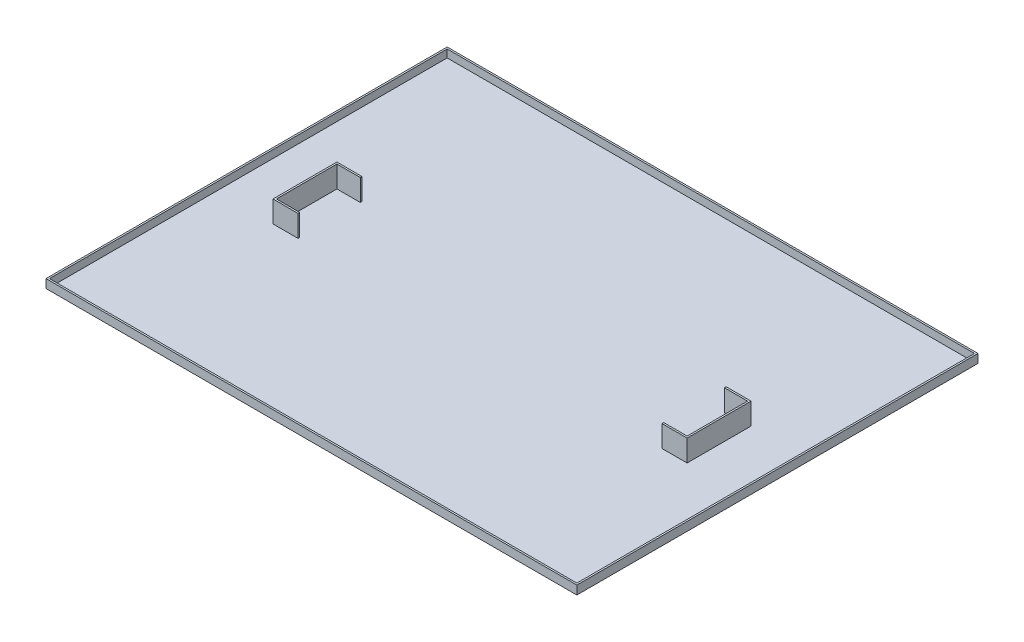
ISO-10303-21;
HEADER;
FILE_DESCRIPTION(('STEP AP214'),'2;1');
FILE_NAME('part.step','',(''),(''),'','','');
FILE_SCHEMA(('AUTOMOTIVE_DESIGN { 1 0 10303 214 1 1 1 1 }'));
ENDSEC;
DATA;
#1=APPLICATION_CONTEXT('core data for automotive mechanical design processes');
#2=APPLICATION_PROTOCOL_DEFINITION('international standard','automotive_design',2000,#1);
#3=PRODUCT_CONTEXT('',#1,'mechanical');
#4=PRODUCT('Part','Part','',(#3));
#5=PRODUCT_RELATED_PRODUCT_CATEGORY('part','',(#4));
#6=PRODUCT_DEFINITION_FORMATION('','',#4);
#7=PRODUCT_DEFINITION_CONTEXT('part definition',#1,'design');
#8=PRODUCT_DEFINITION('design','',#6,#7);
#9=PRODUCT_DEFINITION_SHAPE('','',#8);
#10=(LENGTH_UNIT() NAMED_UNIT(*) SI_UNIT(.MILLI.,.METRE.));
#11=(NAMED_UNIT(*) PLANE_ANGLE_UNIT() SI_UNIT($,.RADIAN.));
#12=(NAMED_UNIT(*) SI_UNIT($,.STERADIAN.) SOLID_ANGLE_UNIT());
#13=UNCERTAINTY_MEASURE_WITH_UNIT(LENGTH_MEASURE(1.E-05),#10,'distance_accuracy_value','');
#14=(GEOMETRIC_REPRESENTATION_CONTEXT(3) GLOBAL_UNCERTAINTY_ASSIGNED_CONTEXT((#13)) GLOBAL_UNIT_ASSIGNED_CONTEXT((#10,
#11,#12)) REPRESENTATION_CONTEXT('',''));
#15=CARTESIAN_POINT('',(0.,0.,0.));
#16=DIRECTION('',(0.,0.,1.));
#17=DIRECTION('',(1.,0.,0.));
#18=AXIS2_PLACEMENT_3D('',#15,#16,#17);
#19=CARTESIAN_POINT('',(-5986.26420659878,10.,0.));
#20=DIRECTION('',(0.,1.,0.));
#21=DIRECTION('',(0.,0.,1.));
#22=AXIS2_PLACEMENT_3D('',#19,#20,#21);
#23=PLANE('',#22);
#24=DIRECTION('',(0.,0.,-1.));
#25=VECTOR('',#24,1.);
#26=CARTESIAN_POINT('',(2105.,10.,350.));
#27=LINE('',#26,#25);
#28=CARTESIAN_POINT('',(2105.,10.,370.));
#29=VERTEX_POINT('',#28);
#30=CARTESIAN_POINT('',(2105.,10.,350.));
#31=VERTEX_POINT('',#30);
#32=EDGE_CURVE('E232',#29,#31,#27,.T.);
#33=ORIENTED_EDGE('',*,*,#32,.T.);
#34=DIRECTION('',(1.,0.,0.));
#35=VECTOR('',#34,1.);
#36=CARTESIAN_POINT('',(2375.,10.,350.));
#37=LINE('',#36,#35);
#38=CARTESIAN_POINT('',(2375.,10.,350.));
#39=VERTEX_POINT('',#38);
#40=EDGE_CURVE('E196',#31,#39,#37,.T.);
#41=ORIENTED_EDGE('',*,*,#40,.T.);
#42=DIRECTION('',(0.,0.,-1.));
#43=VECTOR('',#42,1.);
#44=CARTESIAN_POINT('',(2375.,10.,-350.));
#45=LINE('',#44,#43);
#46=CARTESIAN_POINT('',(2375.,10.,-350.));
#47=VERTEX_POINT('',#46);
#48=EDGE_CURVE('E242',#39,#47,#45,.T.);
#49=ORIENTED_EDGE('',*,*,#48,.T.);
#50=DIRECTION('',(-1.,0.,0.));
#51=VECTOR('',#50,1.);
#52=CARTESIAN_POINT('',(2375.,10.,-350.));
#53=LINE('',#52,#51);
#54=CARTESIAN_POINT('',(2105.,10.,-350.));
#55=VERTEX_POINT('',#54);
#56=EDGE_CURVE('E240',#47,#55,#53,.T.);
#57=ORIENTED_EDGE('',*,*,#56,.T.);
#58=DIRECTION('',(0.,0.,-1.));
#59=VECTOR('',#58,1.);
#60=CARTESIAN_POINT('',(2105.,10.,-370.));
#61=LINE('',#60,#59);
#62=CARTESIAN_POINT('',(2105.,10.,-370.));
#63=VERTEX_POINT('',#62);
#64=EDGE_CURVE('E238',#55,#63,#61,.T.);
#65=ORIENTED_EDGE('',*,*,#64,.T.);
#66=DIRECTION('',(1.,0.,0.));
#67=VECTOR('',#66,1.);
#68=CARTESIAN_POINT('',(2395.,10.,-370.));
#69=LINE('',#68,#67);
#70=CARTESIAN_POINT('',(2395.,10.,-370.));
#71=VERTEX_POINT('',#70);
#72=EDGE_CURVE('E236',#63,#71,#69,.T.);
#73=ORIENTED_EDGE('',*,*,#72,.T.);
#74=DIRECTION('',(0.,0.,1.));
#75=VECTOR('',#74,1.);
#76=CARTESIAN_POINT('',(2395.,10.,-370.));
#77=LINE('',#76,#75);
#78=CARTESIAN_POINT('',(2395.,10.,370.));
#79=VERTEX_POINT('',#78);
#80=EDGE_CURVE('E50',#71,#79,#77,.T.);
#81=ORIENTED_EDGE('',*,*,#80,.T.);
#82=DIRECTION('',(-1.,0.,0.));
#83=VECTOR('',#82,1.);
#84=CARTESIAN_POINT('',(2395.,10.,370.));
#85=LINE('',#84,#83);
#86=EDGE_CURVE('E45',#79,#29,#85,.T.);
#87=ORIENTED_EDGE('',*,*,#86,.T.);
#88=EDGE_LOOP('',(#33,#41,#49,#57,#65,#73,#81,#87));
#89=FACE_BOUND('',#88,.T.);
#90=DIRECTION('',(1.,0.,0.));
#91=VECTOR('',#90,1.);
#92=CARTESIAN_POINT('',(-5986.26420659878,10.,2300.));
#93=LINE('',#92,#91);
#94=CARTESIAN_POINT('',(-3050.,9.99999999999999,2300.));
#95=VERTEX_POINT('',#94);
#96=CARTESIAN_POINT('',(3050.,10.,2300.));
#97=VERTEX_POINT('',#96);
#98=EDGE_CURVE('E316',#95,#97,#93,.T.);
#99=ORIENTED_EDGE('',*,*,#98,.T.);
#100=DIRECTION('',(0.,0.,-1.));
#101=VECTOR('',#100,1.);
#102=CARTESIAN_POINT('',(3050.,10.,0.));
#103=LINE('',#102,#101);
#104=CARTESIAN_POINT('',(3050.,9.99999999999999,-2300.));
#105=VERTEX_POINT('',#104);
#106=EDGE_CURVE('E319',#97,#105,#103,.T.);
#107=ORIENTED_EDGE('',*,*,#106,.T.);
#108=DIRECTION('',(1.,0.,0.));
#109=VECTOR('',#108,1.);
#110=CARTESIAN_POINT('',(-5986.26420659878,10.,-2300.));
#111=LINE('',#110,#109);
#112=CARTESIAN_POINT('',(-3050.,9.99999999999999,-2300.));
#113=VERTEX_POINT('',#112);
#114=EDGE_CURVE('E322',#113,#105,#111,.T.);
#115=ORIENTED_EDGE('',*,*,#114,.F.);
#116=DIRECTION('',(0.,0.,-1.));
#117=VECTOR('',#116,1.);
#118=CARTESIAN_POINT('',(-3050.,10.,0.));
#119=LINE('',#118,#117);
#120=EDGE_CURVE('E324',#95,#113,#119,.T.);
#121=ORIENTED_EDGE('',*,*,#120,.F.);
#122=EDGE_LOOP('',(#99,#107,#115,#121));
#123=FACE_BOUND('',#122,.T.);
#124=DIRECTION('',(0.,0.,-1.));
#125=VECTOR('',#124,1.);
#126=CARTESIAN_POINT('',(-2375.,10.,-350.));
#127=LINE('',#126,#125);
#128=CARTESIAN_POINT('',(-2375.,10.,350.));
#129=VERTEX_POINT('',#128);
#130=CARTESIAN_POINT('',(-2375.,10.,-350.));
#131=VERTEX_POINT('',#130);
#132=EDGE_CURVE('E280',#129,#131,#127,.T.);
#133=ORIENTED_EDGE('',*,*,#132,.F.);
#134=DIRECTION('',(-1.,0.,0.));
#135=VECTOR('',#134,1.);
#136=CARTESIAN_POINT('',(-2375.,10.,350.));
#137=LINE('',#136,#135);
#138=CARTESIAN_POINT('',(-2105.,10.,350.));
#139=VERTEX_POINT('',#138);
#140=EDGE_CURVE('E200',#139,#129,#137,.T.);
#141=ORIENTED_EDGE('',*,*,#140,.F.);
#142=DIRECTION('',(0.,0.,-1.));
#143=VECTOR('',#142,1.);
#144=CARTESIAN_POINT('',(-2105.,10.,350.));
#145=LINE('',#144,#143);
#146=CARTESIAN_POINT('',(-2105.,10.,370.));
#147=VERTEX_POINT('',#146);
#148=EDGE_CURVE('E264',#147,#139,#145,.T.);
#149=ORIENTED_EDGE('',*,*,#148,.F.);
#150=DIRECTION('',(1.,0.,0.));
#151=VECTOR('',#150,1.);
#152=CARTESIAN_POINT('',(-2395.,10.,370.));
#153=LINE('',#152,#151);
#154=CARTESIAN_POINT('',(-2395.,10.,370.));
#155=VERTEX_POINT('',#154);
#156=EDGE_CURVE('E290',#155,#147,#153,.T.);
#157=ORIENTED_EDGE('',*,*,#156,.F.);
#158=DIRECTION('',(0.,0.,1.));
#159=VECTOR('',#158,1.);
#160=CARTESIAN_POINT('',(-2395.,10.,-370.));
#161=LINE('',#160,#159);
#162=CARTESIAN_POINT('',(-2395.,10.,-370.));
#163=VERTEX_POINT('',#162);
#164=EDGE_CURVE('E288',#163,#155,#161,.T.);
#165=ORIENTED_EDGE('',*,*,#164,.F.);
#166=DIRECTION('',(-1.,0.,0.));
#167=VECTOR('',#166,1.);
#168=CARTESIAN_POINT('',(-2395.,10.,-370.));
#169=LINE('',#168,#167);
#170=CARTESIAN_POINT('',(-2105.,10.,-370.));
#171=VERTEX_POINT('',#170);
#172=EDGE_CURVE('E286',#171,#163,#169,.T.);
#173=ORIENTED_EDGE('',*,*,#172,.F.);
#174=DIRECTION('',(0.,0.,-1.));
#175=VECTOR('',#174,1.);
#176=CARTESIAN_POINT('',(-2105.,10.,-370.));
#177=LINE('',#176,#175);
#178=CARTESIAN_POINT('',(-2105.,10.,-350.));
#179=VERTEX_POINT('',#178);
#180=EDGE_CURVE('E284',#179,#171,#177,.T.);
#181=ORIENTED_EDGE('',*,*,#180,.F.);
#182=DIRECTION('',(1.,0.,0.));
#183=VECTOR('',#182,1.);
#184=CARTESIAN_POINT('',(-2125.,10.,-350.));
#185=LINE('',#184,#183);
#186=EDGE_CURVE('E282',#131,#179,#185,.T.);
#187=ORIENTED_EDGE('',*,*,#186,.F.);
#188=EDGE_LOOP('',(#133,#141,#149,#157,#165,#173,#181,#187));
#189=FACE_BOUND('',#188,.T.);
#190=ADVANCED_FACE('F30',(#89,#123,#189),#23,.T.);
#191=CARTESIAN_POINT('',(3070.,100.,2320.));
#192=DIRECTION('',(0.,1.,0.));
#193=DIRECTION('',(0.,0.,1.));
#194=AXIS2_PLACEMENT_3D('',#191,#192,#193);
#195=PLANE('',#194);
#196=DIRECTION('',(1.,0.,0.));
#197=VECTOR('',#196,1.);
#198=CARTESIAN_POINT('',(-3070.,100.,2320.));
#199=LINE('',#198,#197);
#200=CARTESIAN_POINT('',(-3070.,100.,2320.));
#201=VERTEX_POINT('',#200);
#202=CARTESIAN_POINT('',(3070.,100.,2320.));
#203=VERTEX_POINT('',#202);
#204=EDGE_CURVE('E347',#201,#203,#199,.T.);
#205=ORIENTED_EDGE('',*,*,#204,.T.);
#206=DIRECTION('',(0.,0.,-1.));
#207=VECTOR('',#206,1.);
#208=CARTESIAN_POINT('',(3070.,100.,2320.));
#209=LINE('',#208,#207);
#210=CARTESIAN_POINT('',(3070.,100.,-2320.));
#211=VERTEX_POINT('',#210);
#212=EDGE_CURVE('E350',#203,#211,#209,.T.);
#213=ORIENTED_EDGE('',*,*,#212,.T.);
#214=DIRECTION('',(-1.,0.,0.));
#215=VECTOR('',#214,1.);
#216=CARTESIAN_POINT('',(-3070.,100.,-2320.));
#217=LINE('',#216,#215);
#218=CARTESIAN_POINT('',(-3070.,100.,-2320.));
#219=VERTEX_POINT('',#218);
#220=EDGE_CURVE('E353',#211,#219,#217,.T.);
#221=ORIENTED_EDGE('',*,*,#220,.T.);
#222=DIRECTION('',(0.,0.,1.));
#223=VECTOR('',#222,1.);
#224=CARTESIAN_POINT('',(-3070.,100.,2320.));
#225=LINE('',#224,#223);
#226=EDGE_CURVE('E355',#219,#201,#225,.T.);
#227=ORIENTED_EDGE('',*,*,#226,.T.);
#228=EDGE_LOOP('',(#205,#213,#221,#227));
#229=FACE_BOUND('',#228,.T.);
#230=DIRECTION('',(-1.,0.,0.));
#231=VECTOR('',#230,1.);
#232=CARTESIAN_POINT('',(-3050.,100.,-2300.));
#233=LINE('',#232,#231);
#234=CARTESIAN_POINT('',(3050.,100.,-2300.));
#235=VERTEX_POINT('',#234);
#236=CARTESIAN_POINT('',(-3050.,100.,-2300.));
#237=VERTEX_POINT('',#236);
#238=EDGE_CURVE('E328',#235,#237,#233,.T.);
#239=ORIENTED_EDGE('',*,*,#238,.F.);
#240=DIRECTION('',(0.,0.,-1.));
#241=VECTOR('',#240,1.);
#242=CARTESIAN_POINT('',(3050.,100.,2300.));
#243=LINE('',#242,#241);
#244=CARTESIAN_POINT('',(3050.,100.,2300.));
#245=VERTEX_POINT('',#244);
#246=EDGE_CURVE('E326',#245,#235,#243,.T.);
#247=ORIENTED_EDGE('',*,*,#246,.F.);
#248=DIRECTION('',(1.,0.,0.));
#249=VECTOR('',#248,1.);
#250=CARTESIAN_POINT('',(-3050.,100.,2300.));
#251=LINE('',#250,#249);
#252=CARTESIAN_POINT('',(-3050.,100.,2300.));
#253=VERTEX_POINT('',#252);
#254=EDGE_CURVE('E333',#253,#245,#251,.T.);
#255=ORIENTED_EDGE('',*,*,#254,.F.);
#256=DIRECTION('',(0.,0.,1.));
#257=VECTOR('',#256,1.);
#258=CARTESIAN_POINT('',(-3050.,100.,2300.));
#259=LINE('',#258,#257);
#260=EDGE_CURVE('E330',#237,#253,#259,.T.);
#261=ORIENTED_EDGE('',*,*,#260,.F.);
#262=EDGE_LOOP('',(#239,#247,#255,#261));
#263=FACE_BOUND('',#262,.T.);
#264=ADVANCED_FACE('F389',(#229,#263),#195,.T.);
#265=CARTESIAN_POINT('',(3070.,0.,2320.));
#266=DIRECTION('',(0.,1.,0.));
#267=DIRECTION('',(0.,0.,1.));
#268=AXIS2_PLACEMENT_3D('',#265,#266,#267);
#269=PLANE('',#268);
#270=DIRECTION('',(1.,0.,0.));
#271=VECTOR('',#270,1.);
#272=CARTESIAN_POINT('',(-3070.,0.,2320.));
#273=LINE('',#272,#271);
#274=CARTESIAN_POINT('',(-3070.,0.,2320.));
#275=VERTEX_POINT('',#274);
#276=CARTESIAN_POINT('',(3070.,0.,2320.));
#277=VERTEX_POINT('',#276);
#278=EDGE_CURVE('E346',#275,#277,#273,.T.);
#279=ORIENTED_EDGE('',*,*,#278,.F.);
#280=DIRECTION('',(0.,0.,1.));
#281=VECTOR('',#280,1.);
#282=CARTESIAN_POINT('',(-3070.,0.,2320.));
#283=LINE('',#282,#281);
#284=CARTESIAN_POINT('',(-3070.,0.,-2320.));
#285=VERTEX_POINT('',#284);
#286=EDGE_CURVE('E351',#285,#275,#283,.T.);
#287=ORIENTED_EDGE('',*,*,#286,.F.);
#288=DIRECTION('',(-1.,0.,0.));
#289=VECTOR('',#288,1.);
#290=CARTESIAN_POINT('',(-3070.,0.,-2320.));
#291=LINE('',#290,#289);
#292=CARTESIAN_POINT('',(3070.,0.,-2320.));
#293=VERTEX_POINT('',#292);
#294=EDGE_CURVE('E362',#293,#285,#291,.T.);
#295=ORIENTED_EDGE('',*,*,#294,.F.);
#296=DIRECTION('',(0.,0.,-1.));
#297=VECTOR('',#296,1.);
#298=CARTESIAN_POINT('',(3070.,0.,2320.));
#299=LINE('',#298,#297);
#300=EDGE_CURVE('E360',#277,#293,#299,.T.);
#301=ORIENTED_EDGE('',*,*,#300,.F.);
#302=EDGE_LOOP('',(#279,#287,#295,#301));
#303=FACE_BOUND('',#302,.T.);
#304=ADVANCED_FACE('F380',(#303),#269,.F.);
#305=CARTESIAN_POINT('',(-3070.,100.,2320.));
#306=DIRECTION('',(0.,0.,-1.));
#307=DIRECTION('',(-1.,0.,0.));
#308=AXIS2_PLACEMENT_3D('',#305,#306,#307);
#309=PLANE('',#308);
#310=ORIENTED_EDGE('',*,*,#278,.T.);
#311=DIRECTION('',(0.,-1.,0.));
#312=VECTOR('',#311,1.);
#313=CARTESIAN_POINT('',(3070.,100.,2320.));
#314=LINE('',#313,#312);
#315=EDGE_CURVE('E11',#203,#277,#314,.T.);
#316=ORIENTED_EDGE('',*,*,#315,.F.);
#317=ORIENTED_EDGE('',*,*,#204,.F.);
#318=DIRECTION('',(0.,-1.,0.));
#319=VECTOR('',#318,1.);
#320=CARTESIAN_POINT('',(-3070.,100.,2320.));
#321=LINE('',#320,#319);
#322=EDGE_CURVE('E357',#201,#275,#321,.T.);
#323=ORIENTED_EDGE('',*,*,#322,.T.);
#324=EDGE_LOOP('',(#310,#316,#317,#323));
#325=FACE_BOUND('',#324,.T.);
#326=ADVANCED_FACE('F32',(#325),#309,.F.);
#327=CARTESIAN_POINT('',(3070.,100.,2320.));
#328=DIRECTION('',(-1.,0.,0.));
#329=DIRECTION('',(0.,0.,1.));
#330=AXIS2_PLACEMENT_3D('',#327,#328,#329);
#331=PLANE('',#330);
#332=ORIENTED_EDGE('',*,*,#300,.T.);
#333=DIRECTION('',(0.,-1.,0.));
#334=VECTOR('',#333,1.);
#335=CARTESIAN_POINT('',(3070.,100.,-2320.));
#336=LINE('',#335,#334);
#337=EDGE_CURVE('E38',#211,#293,#336,.T.);
#338=ORIENTED_EDGE('',*,*,#337,.F.);
#339=ORIENTED_EDGE('',*,*,#212,.F.);
#340=ORIENTED_EDGE('',*,*,#315,.T.);
#341=EDGE_LOOP('',(#332,#338,#339,#340));
#342=FACE_BOUND('',#341,.T.);
#343=ADVANCED_FACE('F391',(#342),#331,.F.);
#344=CARTESIAN_POINT('',(-3070.,100.,-2320.));
#345=DIRECTION('',(0.,0.,1.));
#346=DIRECTION('',(1.,0.,0.));
#347=AXIS2_PLACEMENT_3D('',#344,#345,#346);
#348=PLANE('',#347);
#349=ORIENTED_EDGE('',*,*,#294,.T.);
#350=DIRECTION('',(0.,-1.,0.));
#351=VECTOR('',#350,1.);
#352=CARTESIAN_POINT('',(-3070.,100.,-2320.));
#353=LINE('',#352,#351);
#354=EDGE_CURVE('E367',#219,#285,#353,.T.);
#355=ORIENTED_EDGE('',*,*,#354,.F.);
#356=ORIENTED_EDGE('',*,*,#220,.F.);
#357=ORIENTED_EDGE('',*,*,#337,.T.);
#358=EDGE_LOOP('',(#349,#355,#356,#357));
#359=FACE_BOUND('',#358,.T.);
#360=ADVANCED_FACE('F374',(#359),#348,.F.);
#361=CARTESIAN_POINT('',(-3070.,100.,2320.));
#362=DIRECTION('',(1.,0.,0.));
#363=DIRECTION('',(0.,0.,-1.));
#364=AXIS2_PLACEMENT_3D('',#361,#362,#363);
#365=PLANE('',#364);
#366=ORIENTED_EDGE('',*,*,#286,.T.);
#367=ORIENTED_EDGE('',*,*,#322,.F.);
#368=ORIENTED_EDGE('',*,*,#226,.F.);
#369=ORIENTED_EDGE('',*,*,#354,.T.);
#370=EDGE_LOOP('',(#366,#367,#368,#369));
#371=FACE_BOUND('',#370,.T.);
#372=ADVANCED_FACE('F383',(#371),#365,.F.);
#373=CARTESIAN_POINT('',(3050.,100.,2300.));
#374=DIRECTION('',(-1.,0.,0.));
#375=DIRECTION('',(0.,0.,1.));
#376=AXIS2_PLACEMENT_3D('',#373,#374,#375);
#377=PLANE('',#376);
#378=ORIENTED_EDGE('',*,*,#106,.F.);
#379=DIRECTION('',(0.,-1.,0.));
#380=VECTOR('',#379,1.);
#381=CARTESIAN_POINT('',(3050.,100.,2300.));
#382=LINE('',#381,#380);
#383=EDGE_CURVE('E335',#245,#97,#382,.T.);
#384=ORIENTED_EDGE('',*,*,#383,.F.);
#385=ORIENTED_EDGE('',*,*,#246,.T.);
#386=DIRECTION('',(0.,-1.,0.));
#387=VECTOR('',#386,1.);
#388=CARTESIAN_POINT('',(3050.,100.,-2300.));
#389=LINE('',#388,#387);
#390=EDGE_CURVE('E343',#235,#105,#389,.T.);
#391=ORIENTED_EDGE('',*,*,#390,.T.);
#392=EDGE_LOOP('',(#378,#384,#385,#391));
#393=FACE_BOUND('',#392,.T.);
#394=ADVANCED_FACE('F420',(#393),#377,.T.);
#395=CARTESIAN_POINT('',(-3050.,100.,-2300.));
#396=DIRECTION('',(0.,0.,1.));
#397=DIRECTION('',(1.,0.,0.));
#398=AXIS2_PLACEMENT_3D('',#395,#396,#397);
#399=PLANE('',#398);
#400=ORIENTED_EDGE('',*,*,#114,.T.);
#401=ORIENTED_EDGE('',*,*,#390,.F.);
#402=ORIENTED_EDGE('',*,*,#238,.T.);
#403=DIRECTION('',(0.,-1.,0.));
#404=VECTOR('',#403,1.);
#405=CARTESIAN_POINT('',(-3050.,100.,-2300.));
#406=LINE('',#405,#404);
#407=EDGE_CURVE('E340',#237,#113,#406,.T.);
#408=ORIENTED_EDGE('',*,*,#407,.T.);
#409=EDGE_LOOP('',(#400,#401,#402,#408));
#410=FACE_BOUND('',#409,.T.);
#411=ADVANCED_FACE('F416',(#410),#399,.T.);
#412=CARTESIAN_POINT('',(-3050.,100.,2300.));
#413=DIRECTION('',(1.,0.,0.));
#414=DIRECTION('',(0.,0.,-1.));
#415=AXIS2_PLACEMENT_3D('',#412,#413,#414);
#416=PLANE('',#415);
#417=ORIENTED_EDGE('',*,*,#120,.T.);
#418=ORIENTED_EDGE('',*,*,#407,.F.);
#419=ORIENTED_EDGE('',*,*,#260,.T.);
#420=DIRECTION('',(0.,-1.,0.));
#421=VECTOR('',#420,1.);
#422=CARTESIAN_POINT('',(-3050.,100.,2300.));
#423=LINE('',#422,#421);
#424=EDGE_CURVE('E337',#253,#95,#423,.T.);
#425=ORIENTED_EDGE('',*,*,#424,.T.);
#426=EDGE_LOOP('',(#417,#418,#419,#425));
#427=FACE_BOUND('',#426,.T.);
#428=ADVANCED_FACE('F412',(#427),#416,.T.);
#429=CARTESIAN_POINT('',(-3050.,100.,2300.));
#430=DIRECTION('',(0.,0.,-1.));
#431=DIRECTION('',(-1.,0.,0.));
#432=AXIS2_PLACEMENT_3D('',#429,#430,#431);
#433=PLANE('',#432);
#434=ORIENTED_EDGE('',*,*,#98,.F.);
#435=ORIENTED_EDGE('',*,*,#424,.F.);
#436=ORIENTED_EDGE('',*,*,#254,.T.);
#437=ORIENTED_EDGE('',*,*,#383,.T.);
#438=EDGE_LOOP('',(#434,#435,#436,#437));
#439=FACE_BOUND('',#438,.T.);
#440=ADVANCED_FACE('F409',(#439),#433,.T.);
#441=CARTESIAN_POINT('',(-2375.,260.,350.));
#442=DIRECTION('',(0.,0.,1.));
#443=DIRECTION('',(1.,0.,0.));
#444=AXIS2_PLACEMENT_3D('',#441,#442,#443);
#445=PLANE('',#444);
#446=ORIENTED_EDGE('',*,*,#140,.T.);
#447=DIRECTION('',(0.,-1.,0.));
#448=VECTOR('',#447,1.);
#449=CARTESIAN_POINT('',(-2375.,260.,350.));
#450=LINE('',#449,#448);
#451=CARTESIAN_POINT('',(-2375.,260.,350.));
#452=VERTEX_POINT('',#451);
#453=EDGE_CURVE('E313',#452,#129,#450,.T.);
#454=ORIENTED_EDGE('',*,*,#453,.F.);
#455=DIRECTION('',(-1.,0.,0.));
#456=VECTOR('',#455,1.);
#457=CARTESIAN_POINT('',(-2125.,260.,350.));
#458=LINE('',#457,#456);
#459=CARTESIAN_POINT('',(-2105.,260.,350.));
#460=VERTEX_POINT('',#459);
#461=EDGE_CURVE('E261',#460,#452,#458,.T.);
#462=ORIENTED_EDGE('',*,*,#461,.F.);
#463=DIRECTION('',(0.,-1.,0.));
#464=VECTOR('',#463,1.);
#465=CARTESIAN_POINT('',(-2105.,260.,350.));
#466=LINE('',#465,#464);
#467=EDGE_CURVE('E278',#460,#139,#466,.T.);
#468=ORIENTED_EDGE('',*,*,#467,.T.);
#469=EDGE_LOOP('',(#446,#454,#462,#468));
#470=FACE_BOUND('',#469,.T.);
#471=ADVANCED_FACE('F407',(#470),#445,.F.);
#472=CARTESIAN_POINT('',(-2375.,260.,-350.));
#473=DIRECTION('',(-1.,0.,0.));
#474=DIRECTION('',(0.,0.,1.));
#475=AXIS2_PLACEMENT_3D('',#472,#473,#474);
#476=PLANE('',#475);
#477=ORIENTED_EDGE('',*,*,#132,.T.);
#478=DIRECTION('',(0.,-1.,0.));
#479=VECTOR('',#478,1.);
#480=CARTESIAN_POINT('',(-2375.,260.,-350.));
#481=LINE('',#480,#479);
#482=CARTESIAN_POINT('',(-2375.,260.,-350.));
#483=VERTEX_POINT('',#482);
#484=EDGE_CURVE('E310',#483,#131,#481,.T.);
#485=ORIENTED_EDGE('',*,*,#484,.F.);
#486=DIRECTION('',(0.,0.,-1.));
#487=VECTOR('',#486,1.);
#488=CARTESIAN_POINT('',(-2375.,260.,-350.));
#489=LINE('',#488,#487);
#490=EDGE_CURVE('E263',#452,#483,#489,.T.);
#491=ORIENTED_EDGE('',*,*,#490,.F.);
#492=ORIENTED_EDGE('',*,*,#453,.T.);
#493=EDGE_LOOP('',(#477,#485,#491,#492));
#494=FACE_BOUND('',#493,.T.);
#495=ADVANCED_FACE('F455',(#494),#476,.F.);
#496=CARTESIAN_POINT('',(-2125.,260.,-350.));
#497=DIRECTION('',(0.,0.,-1.));
#498=DIRECTION('',(-1.,0.,0.));
#499=AXIS2_PLACEMENT_3D('',#496,#497,#498);
#500=PLANE('',#499);
#501=ORIENTED_EDGE('',*,*,#186,.T.);
#502=DIRECTION('',(0.,-1.,0.));
#503=VECTOR('',#502,1.);
#504=CARTESIAN_POINT('',(-2105.,260.,-350.));
#505=LINE('',#504,#503);
#506=CARTESIAN_POINT('',(-2105.,260.,-350.));
#507=VERTEX_POINT('',#506);
#508=EDGE_CURVE('E307',#507,#179,#505,.T.);
#509=ORIENTED_EDGE('',*,*,#508,.F.);
#510=DIRECTION('',(1.,0.,0.));
#511=VECTOR('',#510,1.);
#512=CARTESIAN_POINT('',(-2375.,260.,-350.));
#513=LINE('',#512,#511);
#514=EDGE_CURVE('E266',#483,#507,#513,.T.);
#515=ORIENTED_EDGE('',*,*,#514,.F.);
#516=ORIENTED_EDGE('',*,*,#484,.T.);
#517=EDGE_LOOP('',(#501,#509,#515,#516));
#518=FACE_BOUND('',#517,.T.);
#519=ADVANCED_FACE('F462',(#518),#500,.F.);
#520=CARTESIAN_POINT('',(-2105.,260.,-370.));
#521=DIRECTION('',(-1.,0.,0.));
#522=DIRECTION('',(0.,0.,1.));
#523=AXIS2_PLACEMENT_3D('',#520,#521,#522);
#524=PLANE('',#523);
#525=ORIENTED_EDGE('',*,*,#180,.T.);
#526=DIRECTION('',(0.,-1.,0.));
#527=VECTOR('',#526,1.);
#528=CARTESIAN_POINT('',(-2105.,260.,-370.));
#529=LINE('',#528,#527);
#530=CARTESIAN_POINT('',(-2105.,260.,-370.));
#531=VERTEX_POINT('',#530);
#532=EDGE_CURVE('E304',#531,#171,#529,.T.);
#533=ORIENTED_EDGE('',*,*,#532,.F.);
#534=DIRECTION('',(0.,0.,-1.));
#535=VECTOR('',#534,1.);
#536=CARTESIAN_POINT('',(-2105.,260.,-370.));
#537=LINE('',#536,#535);
#538=EDGE_CURVE('E268',#507,#531,#537,.T.);
#539=ORIENTED_EDGE('',*,*,#538,.F.);
#540=ORIENTED_EDGE('',*,*,#508,.T.);
#541=EDGE_LOOP('',(#525,#533,#539,#540));
#542=FACE_BOUND('',#541,.T.);
#543=ADVANCED_FACE('F469',(#542),#524,.F.);
#544=CARTESIAN_POINT('',(-2395.,260.,-370.));
#545=DIRECTION('',(0.,0.,1.));
#546=DIRECTION('',(1.,0.,0.));
#547=AXIS2_PLACEMENT_3D('',#544,#545,#546);
#548=PLANE('',#547);
#549=ORIENTED_EDGE('',*,*,#172,.T.);
#550=DIRECTION('',(0.,-1.,0.));
#551=VECTOR('',#550,1.);
#552=CARTESIAN_POINT('',(-2395.,260.,-370.));
#553=LINE('',#552,#551);
#554=CARTESIAN_POINT('',(-2395.,260.,-370.));
#555=VERTEX_POINT('',#554);
#556=EDGE_CURVE('E301',#555,#163,#553,.T.);
#557=ORIENTED_EDGE('',*,*,#556,.F.);
#558=DIRECTION('',(-1.,0.,0.));
#559=VECTOR('',#558,1.);
#560=CARTESIAN_POINT('',(-2395.,260.,-370.));
#561=LINE('',#560,#559);
#562=EDGE_CURVE('E270',#531,#555,#561,.T.);
#563=ORIENTED_EDGE('',*,*,#562,.F.);
#564=ORIENTED_EDGE('',*,*,#532,.T.);
#565=EDGE_LOOP('',(#549,#557,#563,#564));
#566=FACE_BOUND('',#565,.T.);
#567=ADVANCED_FACE('F477',(#566),#548,.F.);
#568=CARTESIAN_POINT('',(-2395.,260.,-370.));
#569=DIRECTION('',(1.,0.,0.));
#570=DIRECTION('',(0.,0.,-1.));
#571=AXIS2_PLACEMENT_3D('',#568,#569,#570);
#572=PLANE('',#571);
#573=ORIENTED_EDGE('',*,*,#164,.T.);
#574=DIRECTION('',(0.,-1.,0.));
#575=VECTOR('',#574,1.);
#576=CARTESIAN_POINT('',(-2395.,260.,370.));
#577=LINE('',#576,#575);
#578=CARTESIAN_POINT('',(-2395.,260.,370.));
#579=VERTEX_POINT('',#578);
#580=EDGE_CURVE('E298',#579,#155,#577,.T.);
#581=ORIENTED_EDGE('',*,*,#580,.F.);
#582=DIRECTION('',(0.,0.,1.));
#583=VECTOR('',#582,1.);
#584=CARTESIAN_POINT('',(-2395.,260.,-370.));
#585=LINE('',#584,#583);
#586=EDGE_CURVE('E272',#555,#579,#585,.T.);
#587=ORIENTED_EDGE('',*,*,#586,.F.);
#588=ORIENTED_EDGE('',*,*,#556,.T.);
#589=EDGE_LOOP('',(#573,#581,#587,#588));
#590=FACE_BOUND('',#589,.T.);
#591=ADVANCED_FACE('F485',(#590),#572,.F.);
#592=CARTESIAN_POINT('',(-2395.,260.,370.));
#593=DIRECTION('',(0.,0.,-1.));
#594=DIRECTION('',(-1.,0.,0.));
#595=AXIS2_PLACEMENT_3D('',#592,#593,#594);
#596=PLANE('',#595);
#597=ORIENTED_EDGE('',*,*,#156,.T.);
#598=DIRECTION('',(0.,-1.,0.));
#599=VECTOR('',#598,1.);
#600=CARTESIAN_POINT('',(-2105.,260.,370.));
#601=LINE('',#600,#599);
#602=CARTESIAN_POINT('',(-2105.,260.,370.));
#603=VERTEX_POINT('',#602);
#604=EDGE_CURVE('E296',#603,#147,#601,.T.);
#605=ORIENTED_EDGE('',*,*,#604,.F.);
#606=DIRECTION('',(1.,0.,0.));
#607=VECTOR('',#606,1.);
#608=CARTESIAN_POINT('',(-2395.,260.,370.));
#609=LINE('',#608,#607);
#610=EDGE_CURVE('E274',#579,#603,#609,.T.);
#611=ORIENTED_EDGE('',*,*,#610,.F.);
#612=ORIENTED_EDGE('',*,*,#580,.T.);
#613=EDGE_LOOP('',(#597,#605,#611,#612));
#614=FACE_BOUND('',#613,.T.);
#615=ADVANCED_FACE('F493',(#614),#596,.F.);
#616=CARTESIAN_POINT('',(-2105.,260.,350.));
#617=DIRECTION('',(-1.,0.,0.));
#618=DIRECTION('',(0.,0.,1.));
#619=AXIS2_PLACEMENT_3D('',#616,#617,#618);
#620=PLANE('',#619);
#621=ORIENTED_EDGE('',*,*,#148,.T.);
#622=ORIENTED_EDGE('',*,*,#467,.F.);
#623=DIRECTION('',(0.,0.,-1.));
#624=VECTOR('',#623,1.);
#625=CARTESIAN_POINT('',(-2105.,260.,350.));
#626=LINE('',#625,#624);
#627=EDGE_CURVE('E276',#603,#460,#626,.T.);
#628=ORIENTED_EDGE('',*,*,#627,.F.);
#629=ORIENTED_EDGE('',*,*,#604,.T.);
#630=EDGE_LOOP('',(#621,#622,#628,#629));
#631=FACE_BOUND('',#630,.T.);
#632=ADVANCED_FACE('F501',(#631),#620,.F.);
#633=CARTESIAN_POINT('',(-2105.,260.,350.));
#634=DIRECTION('',(0.,-1.,0.));
#635=DIRECTION('',(0.,0.,-1.));
#636=AXIS2_PLACEMENT_3D('',#633,#634,#635);
#637=PLANE('',#636);
#638=ORIENTED_EDGE('',*,*,#461,.T.);
#639=ORIENTED_EDGE('',*,*,#490,.T.);
#640=ORIENTED_EDGE('',*,*,#514,.T.);
#641=ORIENTED_EDGE('',*,*,#538,.T.);
#642=ORIENTED_EDGE('',*,*,#562,.T.);
#643=ORIENTED_EDGE('',*,*,#586,.T.);
#644=ORIENTED_EDGE('',*,*,#610,.T.);
#645=ORIENTED_EDGE('',*,*,#627,.T.);
#646=EDGE_LOOP('',(#638,#639,#640,#641,#642,#643,#644,#645));
#647=FACE_BOUND('',#646,.T.);
#648=ADVANCED_FACE('F509',(#647),#637,.F.);
#649=CARTESIAN_POINT('',(2105.,260.,350.));
#650=DIRECTION('',(-1.,0.,0.));
#651=DIRECTION('',(0.,0.,1.));
#652=AXIS2_PLACEMENT_3D('',#649,#650,#651);
#653=PLANE('',#652);
#654=ORIENTED_EDGE('',*,*,#32,.F.);
#655=DIRECTION('',(0.,-1.,0.));
#656=VECTOR('',#655,1.);
#657=CARTESIAN_POINT('',(2105.,260.,370.));
#658=LINE('',#657,#656);
#659=CARTESIAN_POINT('',(2105.,260.,370.));
#660=VERTEX_POINT('',#659);
#661=EDGE_CURVE('E201',#660,#29,#658,.T.);
#662=ORIENTED_EDGE('',*,*,#661,.F.);
#663=DIRECTION('',(0.,0.,-1.));
#664=VECTOR('',#663,1.);
#665=CARTESIAN_POINT('',(2105.,260.,350.));
#666=LINE('',#665,#664);
#667=CARTESIAN_POINT('',(2105.,260.,350.));
#668=VERTEX_POINT('',#667);
#669=EDGE_CURVE('E208',#660,#668,#666,.T.);
#670=ORIENTED_EDGE('',*,*,#669,.T.);
#671=DIRECTION('',(0.,-1.,0.));
#672=VECTOR('',#671,1.);
#673=CARTESIAN_POINT('',(2105.,260.,350.));
#674=LINE('',#673,#672);
#675=EDGE_CURVE('E190',#668,#31,#674,.T.);
#676=ORIENTED_EDGE('',*,*,#675,.T.);
#677=EDGE_LOOP('',(#654,#662,#670,#676));
#678=FACE_BOUND('',#677,.T.);
#679=ADVANCED_FACE('F213',(#678),#653,.T.);
#680=CARTESIAN_POINT('',(2395.,260.,370.));
#681=DIRECTION('',(0.,0.,1.));
#682=DIRECTION('',(1.,0.,0.));
#683=AXIS2_PLACEMENT_3D('',#680,#681,#682);
#684=PLANE('',#683);
#685=ORIENTED_EDGE('',*,*,#86,.F.);
#686=DIRECTION('',(0.,-1.,0.));
#687=VECTOR('',#686,1.);
#688=CARTESIAN_POINT('',(2395.,260.,370.));
#689=LINE('',#688,#687);
#690=CARTESIAN_POINT('',(2395.,260.,370.));
#691=VERTEX_POINT('',#690);
#692=EDGE_CURVE('E258',#691,#79,#689,.T.);
#693=ORIENTED_EDGE('',*,*,#692,.F.);
#694=DIRECTION('',(-1.,0.,0.));
#695=VECTOR('',#694,1.);
#696=CARTESIAN_POINT('',(2395.,260.,370.));
#697=LINE('',#696,#695);
#698=EDGE_CURVE('E214',#691,#660,#697,.T.);
#699=ORIENTED_EDGE('',*,*,#698,.T.);
#700=ORIENTED_EDGE('',*,*,#661,.T.);
#701=EDGE_LOOP('',(#685,#693,#699,#700));
#702=FACE_BOUND('',#701,.T.);
#703=ADVANCED_FACE('F524',(#702),#684,.T.);
#704=CARTESIAN_POINT('',(2395.,260.,-370.));
#705=DIRECTION('',(1.,0.,0.));
#706=DIRECTION('',(0.,0.,-1.));
#707=AXIS2_PLACEMENT_3D('',#704,#705,#706);
#708=PLANE('',#707);
#709=ORIENTED_EDGE('',*,*,#80,.F.);
#710=DIRECTION('',(0.,-1.,0.));
#711=VECTOR('',#710,1.);
#712=CARTESIAN_POINT('',(2395.,260.,-370.));
#713=LINE('',#712,#711);
#714=CARTESIAN_POINT('',(2395.,260.,-370.));
#715=VERTEX_POINT('',#714);
#716=EDGE_CURVE('E255',#715,#71,#713,.T.);
#717=ORIENTED_EDGE('',*,*,#716,.F.);
#718=DIRECTION('',(0.,0.,1.));
#719=VECTOR('',#718,1.);
#720=CARTESIAN_POINT('',(2395.,260.,-370.));
#721=LINE('',#720,#719);
#722=EDGE_CURVE('E216',#715,#691,#721,.T.);
#723=ORIENTED_EDGE('',*,*,#722,.T.);
#724=ORIENTED_EDGE('',*,*,#692,.T.);
#725=EDGE_LOOP('',(#709,#717,#723,#724));
#726=FACE_BOUND('',#725,.T.);
#727=ADVANCED_FACE('F531',(#726),#708,.T.);
#728=CARTESIAN_POINT('',(2395.,260.,-370.));
#729=DIRECTION('',(0.,0.,-1.));
#730=DIRECTION('',(-1.,0.,0.));
#731=AXIS2_PLACEMENT_3D('',#728,#729,#730);
#732=PLANE('',#731);
#733=ORIENTED_EDGE('',*,*,#72,.F.);
#734=DIRECTION('',(0.,-1.,0.));
#735=VECTOR('',#734,1.);
#736=CARTESIAN_POINT('',(2105.,260.,-370.));
#737=LINE('',#736,#735);
#738=CARTESIAN_POINT('',(2105.,260.,-370.));
#739=VERTEX_POINT('',#738);
#740=EDGE_CURVE('E252',#739,#63,#737,.T.);
#741=ORIENTED_EDGE('',*,*,#740,.F.);
#742=DIRECTION('',(1.,0.,0.));
#743=VECTOR('',#742,1.);
#744=CARTESIAN_POINT('',(2395.,260.,-370.));
#745=LINE('',#744,#743);
#746=EDGE_CURVE('E221',#739,#715,#745,.T.);
#747=ORIENTED_EDGE('',*,*,#746,.T.);
#748=ORIENTED_EDGE('',*,*,#716,.T.);
#749=EDGE_LOOP('',(#733,#741,#747,#748));
#750=FACE_BOUND('',#749,.T.);
#751=ADVANCED_FACE('F539',(#750),#732,.T.);
#752=CARTESIAN_POINT('',(2105.,260.,-370.));
#753=DIRECTION('',(-1.,0.,0.));
#754=DIRECTION('',(0.,0.,1.));
#755=AXIS2_PLACEMENT_3D('',#752,#753,#754);
#756=PLANE('',#755);
#757=ORIENTED_EDGE('',*,*,#64,.F.);
#758=DIRECTION('',(0.,-1.,0.));
#759=VECTOR('',#758,1.);
#760=CARTESIAN_POINT('',(2105.,260.,-350.));
#761=LINE('',#760,#759);
#762=CARTESIAN_POINT('',(2105.,260.,-350.));
#763=VERTEX_POINT('',#762);
#764=EDGE_CURVE('E249',#763,#55,#761,.T.);
#765=ORIENTED_EDGE('',*,*,#764,.F.);
#766=DIRECTION('',(0.,0.,-1.));
#767=VECTOR('',#766,1.);
#768=CARTESIAN_POINT('',(2105.,260.,-370.));
#769=LINE('',#768,#767);
#770=EDGE_CURVE('E224',#763,#739,#769,.T.);
#771=ORIENTED_EDGE('',*,*,#770,.T.);
#772=ORIENTED_EDGE('',*,*,#740,.T.);
#773=EDGE_LOOP('',(#757,#765,#771,#772));
#774=FACE_BOUND('',#773,.T.);
#775=ADVANCED_FACE('F547',(#774),#756,.T.);
#776=CARTESIAN_POINT('',(2375.,260.,-350.));
#777=DIRECTION('',(0.,0.,1.));
#778=DIRECTION('',(1.,0.,0.));
#779=AXIS2_PLACEMENT_3D('',#776,#777,#778);
#780=PLANE('',#779);
#781=ORIENTED_EDGE('',*,*,#56,.F.);
#782=DIRECTION('',(0.,-1.,0.));
#783=VECTOR('',#782,1.);
#784=CARTESIAN_POINT('',(2375.,260.,-350.));
#785=LINE('',#784,#783);
#786=CARTESIAN_POINT('',(2375.,260.,-350.));
#787=VERTEX_POINT('',#786);
#788=EDGE_CURVE('E246',#787,#47,#785,.T.);
#789=ORIENTED_EDGE('',*,*,#788,.F.);
#790=DIRECTION('',(-1.,0.,0.));
#791=VECTOR('',#790,1.);
#792=CARTESIAN_POINT('',(2125.,260.,-350.));
#793=LINE('',#792,#791);
#794=EDGE_CURVE('E227',#787,#763,#793,.T.);
#795=ORIENTED_EDGE('',*,*,#794,.T.);
#796=ORIENTED_EDGE('',*,*,#764,.T.);
#797=EDGE_LOOP('',(#781,#789,#795,#796));
#798=FACE_BOUND('',#797,.T.);
#799=ADVANCED_FACE('F555',(#798),#780,.T.);
#800=CARTESIAN_POINT('',(2375.,260.,-350.));
#801=DIRECTION('',(-1.,0.,0.));
#802=DIRECTION('',(0.,0.,1.));
#803=AXIS2_PLACEMENT_3D('',#800,#801,#802);
#804=PLANE('',#803);
#805=ORIENTED_EDGE('',*,*,#48,.F.);
#806=DIRECTION('',(0.,-1.,0.));
#807=VECTOR('',#806,1.);
#808=CARTESIAN_POINT('',(2375.,260.,350.));
#809=LINE('',#808,#807);
#810=CARTESIAN_POINT('',(2375.,260.,350.));
#811=VERTEX_POINT('',#810);
#812=EDGE_CURVE('E231',#811,#39,#809,.T.);
#813=ORIENTED_EDGE('',*,*,#812,.F.);
#814=DIRECTION('',(0.,0.,-1.));
#815=VECTOR('',#814,1.);
#816=CARTESIAN_POINT('',(2375.,260.,-350.));
#817=LINE('',#816,#815);
#818=EDGE_CURVE('E211',#811,#787,#817,.T.);
#819=ORIENTED_EDGE('',*,*,#818,.T.);
#820=ORIENTED_EDGE('',*,*,#788,.T.);
#821=EDGE_LOOP('',(#805,#813,#819,#820));
#822=FACE_BOUND('',#821,.T.);
#823=ADVANCED_FACE('F563',(#822),#804,.T.);
#824=CARTESIAN_POINT('',(2375.,260.,350.));
#825=DIRECTION('',(0.,0.,-1.));
#826=DIRECTION('',(-1.,0.,0.));
#827=AXIS2_PLACEMENT_3D('',#824,#825,#826);
#828=PLANE('',#827);
#829=ORIENTED_EDGE('',*,*,#40,.F.);
#830=ORIENTED_EDGE('',*,*,#675,.F.);
#831=DIRECTION('',(1.,0.,0.));
#832=VECTOR('',#831,1.);
#833=CARTESIAN_POINT('',(2125.,260.,350.));
#834=LINE('',#833,#832);
#835=EDGE_CURVE('E194',#668,#811,#834,.T.);
#836=ORIENTED_EDGE('',*,*,#835,.T.);
#837=ORIENTED_EDGE('',*,*,#812,.T.);
#838=EDGE_LOOP('',(#829,#830,#836,#837));
#839=FACE_BOUND('',#838,.T.);
#840=ADVANCED_FACE('F192',(#839),#828,.T.);
#841=CARTESIAN_POINT('',(2105.,260.,350.));
#842=DIRECTION('',(0.,-1.,0.));
#843=DIRECTION('',(0.,0.,-1.));
#844=AXIS2_PLACEMENT_3D('',#841,#842,#843);
#845=PLANE('',#844);
#846=ORIENTED_EDGE('',*,*,#835,.F.);
#847=ORIENTED_EDGE('',*,*,#669,.F.);
#848=ORIENTED_EDGE('',*,*,#698,.F.);
#849=ORIENTED_EDGE('',*,*,#722,.F.);
#850=ORIENTED_EDGE('',*,*,#746,.F.);
#851=ORIENTED_EDGE('',*,*,#770,.F.);
#852=ORIENTED_EDGE('',*,*,#794,.F.);
#853=ORIENTED_EDGE('',*,*,#818,.F.);
#854=EDGE_LOOP('',(#846,#847,#848,#849,#850,#851,#852,#853));
#855=FACE_BOUND('',#854,.T.);
#856=ADVANCED_FACE('F206',(#855),#845,.F.);
#857=CLOSED_SHELL('',(#190,#264,#304,#326,#343,#360,#372,#394,#411,#428,#440,#471,#495,#519,
#543,#567,#591,#615,#632,#648,#679,#703,#727,#751,#775,#799,#823,#840,#856));
#858=MANIFOLD_SOLID_BREP('B2',#857);
#859=ADVANCED_BREP_SHAPE_REPRESENTATION('',(#18,#858),#14);
#860=SHAPE_DEFINITION_REPRESENTATION(#9,#859);
ENDSEC;
END-ISO-10303-21;
